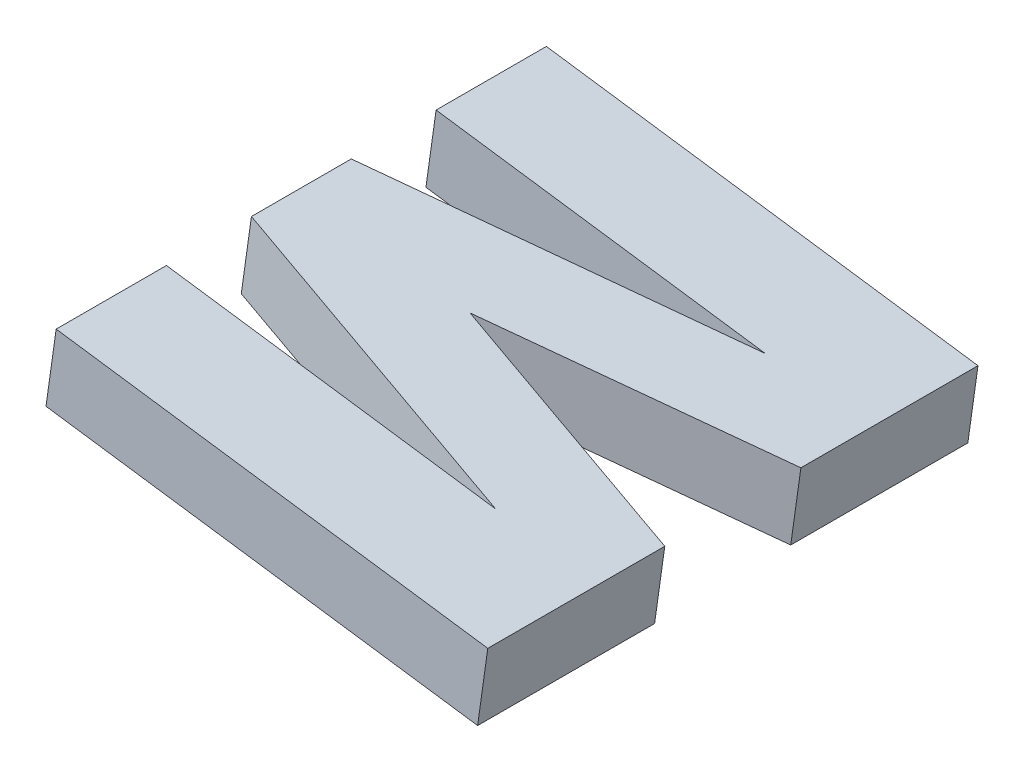
ISO-10303-21;
HEADER;
FILE_DESCRIPTION(('STEP AP214'),'2;1');
FILE_NAME('part.step','',(''),(''),'','','');
FILE_SCHEMA(('AUTOMOTIVE_DESIGN { 1 0 10303 214 1 1 1 1 }'));
ENDSEC;
DATA;
#1=APPLICATION_CONTEXT('core data for automotive mechanical design processes');
#2=APPLICATION_PROTOCOL_DEFINITION('international standard','automotive_design',2000,#1);
#3=PRODUCT_CONTEXT('',#1,'mechanical');
#4=PRODUCT('Part','Part','',(#3));
#5=PRODUCT_RELATED_PRODUCT_CATEGORY('part','',(#4));
#6=PRODUCT_DEFINITION_FORMATION('','',#4);
#7=PRODUCT_DEFINITION_CONTEXT('part definition',#1,'design');
#8=PRODUCT_DEFINITION('design','',#6,#7);
#9=PRODUCT_DEFINITION_SHAPE('','',#8);
#10=(LENGTH_UNIT() NAMED_UNIT(*) SI_UNIT(.MILLI.,.METRE.));
#11=(NAMED_UNIT(*) PLANE_ANGLE_UNIT() SI_UNIT($,.RADIAN.));
#12=(NAMED_UNIT(*) SI_UNIT($,.STERADIAN.) SOLID_ANGLE_UNIT());
#13=UNCERTAINTY_MEASURE_WITH_UNIT(LENGTH_MEASURE(1.E-05),#10,'distance_accuracy_value','');
#14=(GEOMETRIC_REPRESENTATION_CONTEXT(3) GLOBAL_UNCERTAINTY_ASSIGNED_CONTEXT((#13)) GLOBAL_UNIT_ASSIGNED_CONTEXT((#10,
#11,#12)) REPRESENTATION_CONTEXT('',''));
#15=CARTESIAN_POINT('',(0.,0.,0.));
#16=DIRECTION('',(0.,0.,1.));
#17=DIRECTION('',(1.,0.,0.));
#18=AXIS2_PLACEMENT_3D('',#15,#16,#17);
#19=CARTESIAN_POINT('',(740.132497296814,631.832720534706,1848.17932627998));
#20=DIRECTION('',(0.990268068741567,-0.139173100960088,0.));
#21=DIRECTION('',(-0.000106014336864278,-0.000754331202662602,-0.999999709872657));
#22=AXIS2_PLACEMENT_3D('',#19,#20,#21);
#23=PLANE('',#22);
#24=CARTESIAN_POINT('',(738.740766690993,621.930042720328,1848.18694372446));
#25=CARTESIAN_POINT('',(738.742059147497,621.939239026208,1860.37827715877));
#26=CARTESIAN_POINT('',(738.743351604002,621.948435332087,1872.56961059308));
#27=B_SPLINE_CURVE_WITH_KNOTS('',2,(#24,#25,#26),.UNSPECIFIED.,.F.,.F.,(3,3),(0.,1.),.UNSPECIFIED.);
#28=CARTESIAN_POINT('',(738.740766690993,621.930042720328,1848.18694372446));
#29=VERTEX_POINT('',#28);
#30=CARTESIAN_POINT('',(738.743351604002,621.948435332087,1872.56961059308));
#31=VERTEX_POINT('',#30);
#32=EDGE_CURVE('E152',#29,#31,#27,.T.);
#33=ORIENTED_EDGE('',*,*,#32,.F.);
#34=DIRECTION('',(-0.139173060582166,-0.990267781437723,0.000761744447259827));
#35=VECTOR('',#34,1.);
#36=CARTESIAN_POINT('',(740.132497296814,631.832720534706,1848.17932627998));
#37=LINE('',#36,#35);
#38=CARTESIAN_POINT('',(740.132497296814,631.832720534706,1848.17932627998));
#39=VERTEX_POINT('',#38);
#40=EDGE_CURVE('E33',#39,#29,#37,.T.);
#41=ORIENTED_EDGE('',*,*,#40,.F.);
#42=CARTESIAN_POINT('',(740.132497296814,631.832720534706,1848.17932627998));
#43=CARTESIAN_POINT('',(740.133789753319,631.841916840585,1860.3706597143));
#44=CARTESIAN_POINT('',(740.135082209823,631.851113146465,1872.5619931486));
#45=B_SPLINE_CURVE_WITH_KNOTS('',2,(#42,#43,#44),.UNSPECIFIED.,.F.,.F.,(3,3),(0.,1.),.UNSPECIFIED.);
#46=CARTESIAN_POINT('',(740.135082209823,631.851113146465,1872.5619931486));
#47=VERTEX_POINT('',#46);
#48=EDGE_CURVE('E252',#39,#47,#45,.T.);
#49=ORIENTED_EDGE('',*,*,#48,.T.);
#50=DIRECTION('',(-0.139173060582166,-0.990267781437723,0.000761744447259827));
#51=VECTOR('',#50,1.);
#52=CARTESIAN_POINT('',(740.135082209823,631.851113146465,1872.5619931486));
#53=LINE('',#52,#51);
#54=EDGE_CURVE('E11',#47,#31,#53,.T.);
#55=ORIENTED_EDGE('',*,*,#54,.T.);
#56=EDGE_LOOP('',(#33,#41,#49,#55));
#57=FACE_BOUND('',#56,.T.);
#58=ADVANCED_FACE('F17',(#57),#23,.T.);
#59=CARTESIAN_POINT('',(740.135082209823,631.851113146465,1872.5619931486));
#60=DIRECTION('',(0.2471017850086,-0.0339829730865261,0.968393445550807));
#61=DIRECTION('',(0.95894294254338,-0.134962508077653,-0.2494264508019));
#62=AXIS2_PLACEMENT_3D('',#59,#60,#61);
#63=PLANE('',#62);
#64=CARTESIAN_POINT('',(738.743351604002,621.948435332087,1872.56961059308));
#65=CARTESIAN_POINT('',(720.667742589194,624.492413101191,1877.27117812398));
#66=CARTESIAN_POINT('',(702.592133574387,627.036390870295,1881.97274565487));
#67=B_SPLINE_CURVE_WITH_KNOTS('',2,(#64,#65,#66),.UNSPECIFIED.,.F.,.F.,(3,3),(1.,2.),.UNSPECIFIED.);
#68=CARTESIAN_POINT('',(702.592133574387,627.036390870295,1881.97274565487));
#69=VERTEX_POINT('',#68);
#70=EDGE_CURVE('E160',#31,#69,#67,.T.);
#71=ORIENTED_EDGE('',*,*,#70,.F.);
#72=ORIENTED_EDGE('',*,*,#54,.F.);
#73=CARTESIAN_POINT('',(740.135082209823,631.851113146465,1872.5619931486));
#74=CARTESIAN_POINT('',(722.059473195016,634.395090915568,1877.2635606795));
#75=CARTESIAN_POINT('',(703.983864180208,636.939068684673,1881.96512821041));
#76=B_SPLINE_CURVE_WITH_KNOTS('',2,(#73,#74,#75),.UNSPECIFIED.,.F.,.F.,(3,3),(1.,2.),.UNSPECIFIED.);
#77=CARTESIAN_POINT('',(703.983864180208,636.939068684673,1881.96512821041));
#78=VERTEX_POINT('',#77);
#79=EDGE_CURVE('E274',#47,#78,#76,.T.);
#80=ORIENTED_EDGE('',*,*,#79,.T.);
#81=DIRECTION('',(-0.139173060582166,-0.990267781437723,0.000761744447259827));
#82=VECTOR('',#81,1.);
#83=CARTESIAN_POINT('',(703.983864180208,636.939068684673,1881.96512821041));
#84=LINE('',#83,#82);
#85=EDGE_CURVE('E25',#78,#69,#84,.T.);
#86=ORIENTED_EDGE('',*,*,#85,.T.);
#87=EDGE_LOOP('',(#71,#72,#80,#86));
#88=FACE_BOUND('',#87,.T.);
#89=ADVANCED_FACE('F273',(#88),#63,.T.);
#90=CARTESIAN_POINT('',(703.983864180208,636.939068684673,1881.96512821041));
#91=DIRECTION('',(0.245241244653228,-0.035211657238288,-0.968822414643401));
#92=DIRECTION('',(-0.959420445440438,0.134647169450173,-0.2477550173658));
#93=AXIS2_PLACEMENT_3D('',#90,#91,#92);
#94=PLANE('',#93);
#95=CARTESIAN_POINT('',(702.592133574387,627.036390870295,1881.97274565487));
#96=CARTESIAN_POINT('',(720.668735897339,624.499480855891,1886.6407396962));
#97=CARTESIAN_POINT('',(738.745338220292,621.962570841487,1891.30873373752));
#98=B_SPLINE_CURVE_WITH_KNOTS('',2,(#95,#96,#97),.UNSPECIFIED.,.F.,.F.,(3,3),(2.,3.),.UNSPECIFIED.);
#99=CARTESIAN_POINT('',(738.745338220292,621.962570841487,1891.30873373752));
#100=VERTEX_POINT('',#99);
#101=EDGE_CURVE('E168',#69,#100,#98,.T.);
#102=ORIENTED_EDGE('',*,*,#101,.F.);
#103=ORIENTED_EDGE('',*,*,#85,.F.);
#104=CARTESIAN_POINT('',(703.983864180208,636.939068684673,1881.96512821041));
#105=CARTESIAN_POINT('',(722.060466503161,634.402158670269,1886.63312225173));
#106=CARTESIAN_POINT('',(740.137068826113,631.865248655864,1891.30111629304));
#107=B_SPLINE_CURVE_WITH_KNOTS('',2,(#104,#105,#106),.UNSPECIFIED.,.F.,.F.,(3,3),(2.,3.),.UNSPECIFIED.);
#108=CARTESIAN_POINT('',(740.137068826113,631.865248655864,1891.30111629304));
#109=VERTEX_POINT('',#108);
#110=EDGE_CURVE('E283',#78,#109,#107,.T.);
#111=ORIENTED_EDGE('',*,*,#110,.T.);
#112=DIRECTION('',(-0.139173060582166,-0.990267781437723,0.000761744447259827));
#113=VECTOR('',#112,1.);
#114=CARTESIAN_POINT('',(740.137068826113,631.865248655864,1891.30111629304));
#115=LINE('',#114,#113);
#116=EDGE_CURVE('E271',#109,#100,#115,.T.);
#117=ORIENTED_EDGE('',*,*,#116,.T.);
#118=EDGE_LOOP('',(#102,#103,#111,#117));
#119=FACE_BOUND('',#118,.T.);
#120=ADVANCED_FACE('F278',(#119),#94,.T.);
#121=CARTESIAN_POINT('',(740.137068826113,631.865248655864,1891.30111629304));
#122=DIRECTION('',(0.990268068741567,-0.139173100960088,0.));
#123=DIRECTION('',(-0.000106014336859766,-0.000754331202663236,-0.999999709872657));
#124=AXIS2_PLACEMENT_3D('',#121,#122,#123);
#125=PLANE('',#124);
#126=CARTESIAN_POINT('',(738.745338220292,621.962570841487,1891.30873373752));
#127=CARTESIAN_POINT('',(738.746629897146,621.971761599868,1903.49271297888));
#128=CARTESIAN_POINT('',(738.747921574,621.980952358249,1915.67669222023));
#129=B_SPLINE_CURVE_WITH_KNOTS('',2,(#126,#127,#128),.UNSPECIFIED.,.F.,.F.,(3,3),(3.,4.),.UNSPECIFIED.);
#130=CARTESIAN_POINT('',(738.747921574,621.980952358249,1915.67669222023));
#131=VERTEX_POINT('',#130);
#132=EDGE_CURVE('E176',#100,#131,#129,.T.);
#133=ORIENTED_EDGE('',*,*,#132,.F.);
#134=ORIENTED_EDGE('',*,*,#116,.F.);
#135=CARTESIAN_POINT('',(740.137068826113,631.865248655864,1891.30111629304));
#136=CARTESIAN_POINT('',(740.138360502968,631.874439414245,1903.4850955344));
#137=CARTESIAN_POINT('',(740.139652179822,631.883630172626,1915.66907477576));
#138=B_SPLINE_CURVE_WITH_KNOTS('',2,(#135,#136,#137),.UNSPECIFIED.,.F.,.F.,(3,3),(3.,4.),.UNSPECIFIED.);
#139=CARTESIAN_POINT('',(740.139652179822,631.883630172626,1915.66907477576));
#140=VERTEX_POINT('',#139);
#141=EDGE_CURVE('E299',#109,#140,#138,.T.);
#142=ORIENTED_EDGE('',*,*,#141,.T.);
#143=DIRECTION('',(-0.139173060582166,-0.990267781437723,0.000761744447259827));
#144=VECTOR('',#143,1.);
#145=CARTESIAN_POINT('',(740.139652179822,631.883630172626,1915.66907477576));
#146=LINE('',#145,#144);
#147=EDGE_CURVE('E269',#140,#131,#146,.T.);
#148=ORIENTED_EDGE('',*,*,#147,.T.);
#149=EDGE_LOOP('',(#133,#134,#142,#148));
#150=FACE_BOUND('',#149,.T.);
#151=ADVANCED_FACE('F379',(#150),#125,.T.);
#152=CARTESIAN_POINT('',(740.139652179822,631.883630172626,1915.66907477576));
#153=DIRECTION('',(0.000106014336864278,0.000754331202662602,0.999999709872657));
#154=DIRECTION('',(0.990268068741567,-0.139173100960088,0.));
#155=AXIS2_PLACEMENT_3D('',#152,#153,#154);
#156=PLANE('',#155);
#157=CARTESIAN_POINT('',(738.747921574,621.980952358249,1915.67669222023));
#158=CARTESIAN_POINT('',(709.039879511753,626.156145387051,1915.67669222023));
#159=CARTESIAN_POINT('',(679.331837449506,630.331338415854,1915.67669222023));
#160=B_SPLINE_CURVE_WITH_KNOTS('',2,(#157,#158,#159),.UNSPECIFIED.,.F.,.F.,(3,3),(4.,5.),.UNSPECIFIED.);
#161=CARTESIAN_POINT('',(679.331837449506,630.331338415854,1915.67669222023));
#162=VERTEX_POINT('',#161);
#163=EDGE_CURVE('E184',#131,#162,#160,.T.);
#164=ORIENTED_EDGE('',*,*,#163,.F.);
#165=ORIENTED_EDGE('',*,*,#147,.F.);
#166=CARTESIAN_POINT('',(740.139652179822,631.883630172626,1915.66907477576));
#167=CARTESIAN_POINT('',(710.431610117575,636.058823201429,1915.66907477576));
#168=CARTESIAN_POINT('',(680.723568055328,640.234016230231,1915.66907477576));
#169=B_SPLINE_CURVE_WITH_KNOTS('',2,(#166,#167,#168),.UNSPECIFIED.,.F.,.F.,(3,3),(4.,5.),.UNSPECIFIED.);
#170=CARTESIAN_POINT('',(680.723568055328,640.234016230231,1915.66907477576));
#171=VERTEX_POINT('',#170);
#172=EDGE_CURVE('E307',#140,#171,#169,.T.);
#173=ORIENTED_EDGE('',*,*,#172,.T.);
#174=DIRECTION('',(-0.139173060582166,-0.990267781437723,0.000761744447259827));
#175=VECTOR('',#174,1.);
#176=CARTESIAN_POINT('',(680.723568055328,640.234016230231,1915.66907477576));
#177=LINE('',#176,#175);
#178=EDGE_CURVE('E267',#171,#162,#177,.T.);
#179=ORIENTED_EDGE('',*,*,#178,.T.);
#180=EDGE_LOOP('',(#164,#165,#173,#179));
#181=FACE_BOUND('',#180,.T.);
#182=ADVANCED_FACE('F377',(#181),#156,.T.);
#183=CARTESIAN_POINT('',(680.723568055328,640.234016230231,1915.66907477576));
#184=DIRECTION('',(-0.990268068741567,0.139173100960088,0.));
#185=DIRECTION('',(0.000106014336864278,0.000754331202662602,0.999999709872657));
#186=AXIS2_PLACEMENT_3D('',#183,#184,#185);
#187=PLANE('',#186);
#188=CARTESIAN_POINT('',(679.331837449506,630.331338415854,1915.67669222023));
#189=CARTESIAN_POINT('',(679.331032579404,630.325611467501,1908.08460711048));
#190=CARTESIAN_POINT('',(679.330227709303,630.319884519148,1900.49252200074));
#191=B_SPLINE_CURVE_WITH_KNOTS('',2,(#188,#189,#190),.UNSPECIFIED.,.F.,.F.,(3,3),(5.,6.),.UNSPECIFIED.);
#192=CARTESIAN_POINT('',(679.330227709303,630.319884519148,1900.49252200074));
#193=VERTEX_POINT('',#192);
#194=EDGE_CURVE('E192',#162,#193,#191,.T.);
#195=ORIENTED_EDGE('',*,*,#194,.F.);
#196=ORIENTED_EDGE('',*,*,#178,.F.);
#197=CARTESIAN_POINT('',(680.723568055328,640.234016230231,1915.66907477576));
#198=CARTESIAN_POINT('',(680.722763185226,640.228289281878,1908.07698966601));
#199=CARTESIAN_POINT('',(680.721958315124,640.222562333525,1900.48490455627));
#200=B_SPLINE_CURVE_WITH_KNOTS('',2,(#197,#198,#199),.UNSPECIFIED.,.F.,.F.,(3,3),(5.,6.),.UNSPECIFIED.);
#201=CARTESIAN_POINT('',(680.721958315124,640.222562333525,1900.48490455627));
#202=VERTEX_POINT('',#201);
#203=EDGE_CURVE('E315',#171,#202,#200,.T.);
#204=ORIENTED_EDGE('',*,*,#203,.T.);
#205=DIRECTION('',(-0.139173060582166,-0.990267781437723,0.000761744447259827));
#206=VECTOR('',#205,1.);
#207=CARTESIAN_POINT('',(680.721958315124,640.222562333525,1900.48490455627));
#208=LINE('',#207,#206);
#209=EDGE_CURVE('E265',#202,#193,#208,.T.);
#210=ORIENTED_EDGE('',*,*,#209,.T.);
#211=EDGE_LOOP('',(#195,#196,#204,#210));
#212=FACE_BOUND('',#211,.T.);
#213=ADVANCED_FACE('F374',(#212),#187,.T.);
#214=CARTESIAN_POINT('',(680.721958315124,640.222562333525,1900.48490455627));
#215=DIRECTION('',(-0.000106014336864278,-0.000754331202662602,-0.999999709872657));
#216=DIRECTION('',(-0.990268068741567,0.139173100960088,0.));
#217=AXIS2_PLACEMENT_3D('',#214,#215,#216);
#218=PLANE('',#217);
#219=CARTESIAN_POINT('',(679.330227709303,630.319884519148,1900.49252200074));
#220=CARTESIAN_POINT('',(701.986156103294,627.135801431698,1900.49252200074));
#221=CARTESIAN_POINT('',(724.642084497286,623.951718344248,1900.49252200074));
#222=B_SPLINE_CURVE_WITH_KNOTS('',2,(#219,#220,#221),.UNSPECIFIED.,.F.,.F.,(3,3),(6.,7.),.UNSPECIFIED.);
#223=CARTESIAN_POINT('',(724.642084497286,623.951718344248,1900.49252200074));
#224=VERTEX_POINT('',#223);
#225=EDGE_CURVE('E200',#193,#224,#222,.T.);
#226=ORIENTED_EDGE('',*,*,#225,.F.);
#227=ORIENTED_EDGE('',*,*,#209,.F.);
#228=CARTESIAN_POINT('',(680.721958315124,640.222562333525,1900.48490455627));
#229=CARTESIAN_POINT('',(703.377886709116,637.038479246075,1900.48490455627));
#230=CARTESIAN_POINT('',(726.033815103108,633.854396158626,1900.48490455627));
#231=B_SPLINE_CURVE_WITH_KNOTS('',2,(#228,#229,#230),.UNSPECIFIED.,.F.,.F.,(3,3),(6.,7.),.UNSPECIFIED.);
#232=CARTESIAN_POINT('',(726.033815103108,633.854396158626,1900.48490455627));
#233=VERTEX_POINT('',#232);
#234=EDGE_CURVE('E323',#202,#233,#231,.T.);
#235=ORIENTED_EDGE('',*,*,#234,.T.);
#236=DIRECTION('',(-0.139173060582166,-0.990267781437723,0.000761744447259827));
#237=VECTOR('',#236,1.);
#238=CARTESIAN_POINT('',(726.033815103108,633.854396158626,1900.48490455627));
#239=LINE('',#238,#237);
#240=EDGE_CURVE('E263',#233,#224,#239,.T.);
#241=ORIENTED_EDGE('',*,*,#240,.T.);
#242=EDGE_LOOP('',(#226,#227,#235,#241));
#243=FACE_BOUND('',#242,.T.);
#244=ADVANCED_FACE('F368',(#243),#218,.T.);
#245=CARTESIAN_POINT('',(726.033815103108,633.854396158626,1900.48490455627));
#246=DIRECTION('',(-0.245205377846042,0.035206623611352,0.968831675952675));
#247=DIRECTION('',(0.959429612782289,-0.13464848569627,0.247718799076955));
#248=AXIS2_PLACEMENT_3D('',#245,#246,#247);
#249=PLANE('',#248);
#250=CARTESIAN_POINT('',(724.642084497286,623.951718344248,1900.49252200074));
#251=CARTESIAN_POINT('',(701.985535942474,627.131388758175,1894.6427411263));
#252=CARTESIAN_POINT('',(679.328987387662,630.311059172103,1888.79296025186));
#253=B_SPLINE_CURVE_WITH_KNOTS('',2,(#250,#251,#252),.UNSPECIFIED.,.F.,.F.,(3,3),(7.,8.),.UNSPECIFIED.);
#254=CARTESIAN_POINT('',(679.328987387662,630.311059172103,1888.79296025186));
#255=VERTEX_POINT('',#254);
#256=EDGE_CURVE('E208',#224,#255,#253,.T.);
#257=ORIENTED_EDGE('',*,*,#256,.F.);
#258=ORIENTED_EDGE('',*,*,#240,.F.);
#259=CARTESIAN_POINT('',(726.033815103108,633.854396158626,1900.48490455627));
#260=CARTESIAN_POINT('',(703.377266548296,637.034066572553,1894.63512368183));
#261=CARTESIAN_POINT('',(680.720717993484,640.21373698648,1888.78534280739));
#262=B_SPLINE_CURVE_WITH_KNOTS('',2,(#259,#260,#261),.UNSPECIFIED.,.F.,.F.,(3,3),(7.,8.),.UNSPECIFIED.);
#263=CARTESIAN_POINT('',(680.720717993484,640.21373698648,1888.78534280739));
#264=VERTEX_POINT('',#263);
#265=EDGE_CURVE('E331',#233,#264,#262,.T.);
#266=ORIENTED_EDGE('',*,*,#265,.T.);
#267=DIRECTION('',(-0.139173060582166,-0.990267781437723,0.000761744447259827));
#268=VECTOR('',#267,1.);
#269=CARTESIAN_POINT('',(680.720717993484,640.21373698648,1888.78534280739));
#270=LINE('',#269,#268);
#271=EDGE_CURVE('E261',#264,#255,#270,.T.);
#272=ORIENTED_EDGE('',*,*,#271,.T.);
#273=EDGE_LOOP('',(#257,#258,#266,#272));
#274=FACE_BOUND('',#273,.T.);
#275=ADVANCED_FACE('F365',(#274),#249,.T.);
#276=CARTESIAN_POINT('',(680.720717993484,640.21373698648,1888.78534280739));
#277=DIRECTION('',(-0.990268068741567,0.139173100960088,0.));
#278=DIRECTION('',(0.000106014336864278,0.000754331202662602,0.999999709872657));
#279=AXIS2_PLACEMENT_3D('',#276,#277,#278);
#280=PLANE('',#279);
#281=CARTESIAN_POINT('',(679.328987387662,630.311059172103,1888.79296025186));
#282=CARTESIAN_POINT('',(679.328258855476,630.305875396243,1881.92094655667));
#283=CARTESIAN_POINT('',(679.32753032329,630.300691620384,1875.04893286148));
#284=B_SPLINE_CURVE_WITH_KNOTS('',2,(#281,#282,#283),.UNSPECIFIED.,.F.,.F.,(3,3),(8.,9.),.UNSPECIFIED.);
#285=CARTESIAN_POINT('',(679.32753032329,630.300691620384,1875.04893286148));
#286=VERTEX_POINT('',#285);
#287=EDGE_CURVE('E216',#255,#286,#284,.T.);
#288=ORIENTED_EDGE('',*,*,#287,.F.);
#289=ORIENTED_EDGE('',*,*,#271,.F.);
#290=CARTESIAN_POINT('',(680.720717993484,640.21373698648,1888.78534280739));
#291=CARTESIAN_POINT('',(680.719989461298,640.20855321062,1881.9133291122));
#292=CARTESIAN_POINT('',(680.719260929112,640.203369434761,1875.04131541701));
#293=B_SPLINE_CURVE_WITH_KNOTS('',2,(#290,#291,#292),.UNSPECIFIED.,.F.,.F.,(3,3),(8.,9.),.UNSPECIFIED.);
#294=CARTESIAN_POINT('',(680.719260929112,640.203369434761,1875.04131541701));
#295=VERTEX_POINT('',#294);
#296=EDGE_CURVE('E339',#264,#295,#293,.T.);
#297=ORIENTED_EDGE('',*,*,#296,.T.);
#298=DIRECTION('',(-0.139173060582166,-0.990267781437723,0.000761744447259827));
#299=VECTOR('',#298,1.);
#300=CARTESIAN_POINT('',(680.719260929112,640.203369434761,1875.04131541701));
#301=LINE('',#300,#299);
#302=EDGE_CURVE('E259',#295,#286,#301,.T.);
#303=ORIENTED_EDGE('',*,*,#302,.T.);
#304=EDGE_LOOP('',(#288,#289,#297,#303));
#305=FACE_BOUND('',#304,.T.);
#306=ADVANCED_FACE('F362',(#305),#280,.T.);
#307=CARTESIAN_POINT('',(680.719260929112,640.203369434761,1875.04131541701));
#308=DIRECTION('',(-0.244982823732579,0.0336847504738838,-0.968942079621648));
#309=DIRECTION('',(-0.959486464356953,0.135037249053446,0.247286607166407));
#310=AXIS2_PLACEMENT_3D('',#307,#308,#309);
#311=PLANE('',#310);
#312=CARTESIAN_POINT('',(679.32753032329,630.300691620384,1875.04893286148));
#313=CARTESIAN_POINT('',(701.982839708988,627.112204060062,1869.21002340272));
#314=CARTESIAN_POINT('',(724.638149094686,623.92371649974,1863.37111394394));
#315=B_SPLINE_CURVE_WITH_KNOTS('',2,(#312,#313,#314),.UNSPECIFIED.,.F.,.F.,(3,3),(9.,10.),.UNSPECIFIED.);
#316=CARTESIAN_POINT('',(724.638149094686,623.92371649974,1863.37111394394));
#317=VERTEX_POINT('',#316);
#318=EDGE_CURVE('E224',#286,#317,#315,.T.);
#319=ORIENTED_EDGE('',*,*,#318,.F.);
#320=ORIENTED_EDGE('',*,*,#302,.F.);
#321=CARTESIAN_POINT('',(680.719260929112,640.203369434761,1875.04131541701));
#322=CARTESIAN_POINT('',(703.37457031481,637.014881874439,1869.20240595824));
#323=CARTESIAN_POINT('',(726.029879700508,633.826394314117,1863.36349649947));
#324=B_SPLINE_CURVE_WITH_KNOTS('',2,(#321,#322,#323),.UNSPECIFIED.,.F.,.F.,(3,3),(9.,10.),.UNSPECIFIED.);
#325=CARTESIAN_POINT('',(726.029879700508,633.826394314117,1863.36349649947));
#326=VERTEX_POINT('',#325);
#327=EDGE_CURVE('E134',#295,#326,#324,.T.);
#328=ORIENTED_EDGE('',*,*,#327,.T.);
#329=DIRECTION('',(-0.139173060582166,-0.990267781437723,0.000761744447259827));
#330=VECTOR('',#329,1.);
#331=CARTESIAN_POINT('',(726.029879700508,633.826394314117,1863.36349649947));
#332=LINE('',#331,#330);
#333=EDGE_CURVE('E126',#326,#317,#332,.T.);
#334=ORIENTED_EDGE('',*,*,#333,.T.);
#335=EDGE_LOOP('',(#319,#320,#328,#334));
#336=FACE_BOUND('',#335,.T.);
#337=ADVANCED_FACE('F356',(#336),#311,.T.);
#338=CARTESIAN_POINT('',(726.029879700508,633.826394314117,1863.36349649947));
#339=DIRECTION('',(0.000106014336864278,0.000754331202662602,0.999999709872657));
#340=DIRECTION('',(0.990268068741567,-0.139173100960088,0.));
#341=AXIS2_PLACEMENT_3D('',#338,#339,#340);
#342=PLANE('',#341);
#343=CARTESIAN_POINT('',(724.638149094686,623.92371649974,1863.37111394394));
#344=CARTESIAN_POINT('',(701.982220700694,627.10779958719,1863.37111394394));
#345=CARTESIAN_POINT('',(679.326292306702,630.29188267464,1863.37111394394));
#346=B_SPLINE_CURVE_WITH_KNOTS('',2,(#343,#344,#345),.UNSPECIFIED.,.F.,.F.,(3,3),(10.,11.),.UNSPECIFIED.);
#347=CARTESIAN_POINT('',(679.326292306702,630.29188267464,1863.37111394394));
#348=VERTEX_POINT('',#347);
#349=EDGE_CURVE('E232',#317,#348,#346,.T.);
#350=ORIENTED_EDGE('',*,*,#349,.F.);
#351=ORIENTED_EDGE('',*,*,#333,.F.);
#352=CARTESIAN_POINT('',(726.029879700508,633.826394314117,1863.36349649947));
#353=CARTESIAN_POINT('',(703.373951306516,637.010477401567,1863.36349649947));
#354=CARTESIAN_POINT('',(680.718022912524,640.194560489017,1863.36349649947));
#355=B_SPLINE_CURVE_WITH_KNOTS('',2,(#352,#353,#354),.UNSPECIFIED.,.F.,.F.,(3,3),(10.,11.),.UNSPECIFIED.);
#356=CARTESIAN_POINT('',(680.718022912524,640.194560489017,1863.36349649947));
#357=VERTEX_POINT('',#356);
#358=EDGE_CURVE('E129',#326,#357,#355,.T.);
#359=ORIENTED_EDGE('',*,*,#358,.T.);
#360=DIRECTION('',(-0.139173060582166,-0.990267781437723,0.000761744447259827));
#361=VECTOR('',#360,1.);
#362=CARTESIAN_POINT('',(680.718022912524,640.194560489017,1863.36349649947));
#363=LINE('',#362,#361);
#364=EDGE_CURVE('E115',#357,#348,#363,.T.);
#365=ORIENTED_EDGE('',*,*,#364,.T.);
#366=EDGE_LOOP('',(#350,#351,#359,#365));
#367=FACE_BOUND('',#366,.T.);
#368=ADVANCED_FACE('F130',(#367),#342,.T.);
#369=CARTESIAN_POINT('',(680.718022912524,640.194560489017,1863.36349649947));
#370=DIRECTION('',(-0.990268068741567,0.139173100960088,0.));
#371=DIRECTION('',(0.000106014336871519,0.000754331202661584,0.999999709872657));
#372=AXIS2_PLACEMENT_3D('',#369,#370,#371);
#373=PLANE('',#372);
#374=CARTESIAN_POINT('',(679.326292306702,630.29188267464,1863.37111394394));
#375=CARTESIAN_POINT('',(679.3254874366,630.286155726287,1855.7790288342));
#376=CARTESIAN_POINT('',(679.324682566498,630.280428777933,1848.18694372446));
#377=B_SPLINE_CURVE_WITH_KNOTS('',2,(#374,#375,#376),.UNSPECIFIED.,.F.,.F.,(3,3),(11.,12.),.UNSPECIFIED.);
#378=CARTESIAN_POINT('',(679.324682566498,630.280428777933,1848.18694372446));
#379=VERTEX_POINT('',#378);
#380=EDGE_CURVE('E122',#348,#379,#377,.T.);
#381=ORIENTED_EDGE('',*,*,#380,.F.);
#382=ORIENTED_EDGE('',*,*,#364,.F.);
#383=CARTESIAN_POINT('',(680.718022912524,640.194560489017,1863.36349649947));
#384=CARTESIAN_POINT('',(680.717218042422,640.188833540664,1855.77141138973));
#385=CARTESIAN_POINT('',(680.71641317232,640.183106592311,1848.17932627998));
#386=B_SPLINE_CURVE_WITH_KNOTS('',2,(#383,#384,#385),.UNSPECIFIED.,.F.,.F.,(3,3),(11.,12.),.UNSPECIFIED.);
#387=CARTESIAN_POINT('',(680.71641317232,640.183106592311,1848.17932627998));
#388=VERTEX_POINT('',#387);
#389=EDGE_CURVE('E119',#357,#388,#386,.T.);
#390=ORIENTED_EDGE('',*,*,#389,.T.);
#391=DIRECTION('',(-0.139173060582166,-0.990267781437723,0.000761744447259827));
#392=VECTOR('',#391,1.);
#393=CARTESIAN_POINT('',(680.71641317232,640.183106592311,1848.17932627998));
#394=LINE('',#393,#392);
#395=EDGE_CURVE('E76',#388,#379,#394,.T.);
#396=ORIENTED_EDGE('',*,*,#395,.T.);
#397=EDGE_LOOP('',(#381,#382,#390,#396));
#398=FACE_BOUND('',#397,.T.);
#399=ADVANCED_FACE('F117',(#398),#373,.T.);
#400=CARTESIAN_POINT('',(680.71641317232,640.183106592311,1848.17932627998));
#401=DIRECTION('',(-0.000106014336864278,-0.000754331202662602,-0.999999709872657));
#402=DIRECTION('',(-0.990268068741567,0.139173100960088,0.));
#403=AXIS2_PLACEMENT_3D('',#400,#401,#402);
#404=PLANE('',#403);
#405=CARTESIAN_POINT('',(679.324682566498,630.280428777933,1848.18694372446));
#406=CARTESIAN_POINT('',(709.032724628745,626.105235749131,1848.18694372446));
#407=CARTESIAN_POINT('',(738.740766690993,621.930042720328,1848.18694372446));
#408=B_SPLINE_CURVE_WITH_KNOTS('',2,(#405,#406,#407),.UNSPECIFIED.,.F.,.F.,(3,3),(12.,13.),.UNSPECIFIED.);
#409=EDGE_CURVE('E245',#379,#29,#408,.T.);
#410=ORIENTED_EDGE('',*,*,#409,.F.);
#411=ORIENTED_EDGE('',*,*,#395,.F.);
#412=CARTESIAN_POINT('',(680.71641317232,640.183106592311,1848.17932627998));
#413=CARTESIAN_POINT('',(710.424455234567,636.007913563508,1848.17932627998));
#414=CARTESIAN_POINT('',(740.132497296814,631.832720534706,1848.17932627998));
#415=B_SPLINE_CURVE_WITH_KNOTS('',2,(#412,#413,#414),.UNSPECIFIED.,.F.,.F.,(3,3),(12.,13.),.UNSPECIFIED.);
#416=EDGE_CURVE('E138',#388,#39,#415,.T.);
#417=ORIENTED_EDGE('',*,*,#416,.T.);
#418=ORIENTED_EDGE('',*,*,#40,.T.);
#419=EDGE_LOOP('',(#410,#411,#417,#418));
#420=FACE_BOUND('',#419,.T.);
#421=ADVANCED_FACE('F474',(#420),#404,.T.);
#422=CARTESIAN_POINT('',(740.133789753319,631.841916840585,1860.3706597143));
#423=DIRECTION('',(0.139173060582165,0.990267781437723,-0.000761744447241614));
#424=DIRECTION('',(0.000106014336861743,0.000754331202644566,0.999999709872657));
#425=AXIS2_PLACEMENT_3D('',#422,#423,#424);
#426=PLANE('',#425);
#427=ORIENTED_EDGE('',*,*,#48,.F.);
#428=ORIENTED_EDGE('',*,*,#416,.F.);
#429=ORIENTED_EDGE('',*,*,#389,.F.);
#430=ORIENTED_EDGE('',*,*,#358,.F.);
#431=ORIENTED_EDGE('',*,*,#327,.F.);
#432=ORIENTED_EDGE('',*,*,#296,.F.);
#433=ORIENTED_EDGE('',*,*,#265,.F.);
#434=ORIENTED_EDGE('',*,*,#234,.F.);
#435=ORIENTED_EDGE('',*,*,#203,.F.);
#436=ORIENTED_EDGE('',*,*,#172,.F.);
#437=ORIENTED_EDGE('',*,*,#141,.F.);
#438=ORIENTED_EDGE('',*,*,#110,.F.);
#439=ORIENTED_EDGE('',*,*,#79,.F.);
#440=EDGE_LOOP('',(#427,#428,#429,#430,#431,#432,#433,#434,#435,#436,#437,#438,#439));
#441=FACE_BOUND('',#440,.T.);
#442=ADVANCED_FACE('F137',(#441),#426,.T.);
#443=CARTESIAN_POINT('',(738.742059147497,621.939239026208,1860.37827715877));
#444=DIRECTION('',(0.139173060582165,0.990267781437723,-0.000761744447241614));
#445=DIRECTION('',(0.000106014336861743,0.000754331202644566,0.999999709872657));
#446=AXIS2_PLACEMENT_3D('',#443,#444,#445);
#447=PLANE('',#446);
#448=ORIENTED_EDGE('',*,*,#32,.T.);
#449=ORIENTED_EDGE('',*,*,#70,.T.);
#450=ORIENTED_EDGE('',*,*,#101,.T.);
#451=ORIENTED_EDGE('',*,*,#132,.T.);
#452=ORIENTED_EDGE('',*,*,#163,.T.);
#453=ORIENTED_EDGE('',*,*,#194,.T.);
#454=ORIENTED_EDGE('',*,*,#225,.T.);
#455=ORIENTED_EDGE('',*,*,#256,.T.);
#456=ORIENTED_EDGE('',*,*,#287,.T.);
#457=ORIENTED_EDGE('',*,*,#318,.T.);
#458=ORIENTED_EDGE('',*,*,#349,.T.);
#459=ORIENTED_EDGE('',*,*,#380,.T.);
#460=ORIENTED_EDGE('',*,*,#409,.T.);
#461=EDGE_LOOP('',(#448,#449,#450,#451,#452,#453,#454,#455,#456,#457,#458,#459,#460));
#462=FACE_BOUND('',#461,.T.);
#463=ADVANCED_FACE('F281',(#462),#447,.F.);
#464=CLOSED_SHELL('',(#58,#89,#120,#151,#182,#213,#244,#275,#306,#337,#368,#399,#421,#442,#463));
#465=MANIFOLD_SOLID_BREP('B1',#464);
#466=ADVANCED_BREP_SHAPE_REPRESENTATION('',(#18,#465),#14);
#467=SHAPE_DEFINITION_REPRESENTATION(#9,#466);
ENDSEC;
END-ISO-10303-21;
